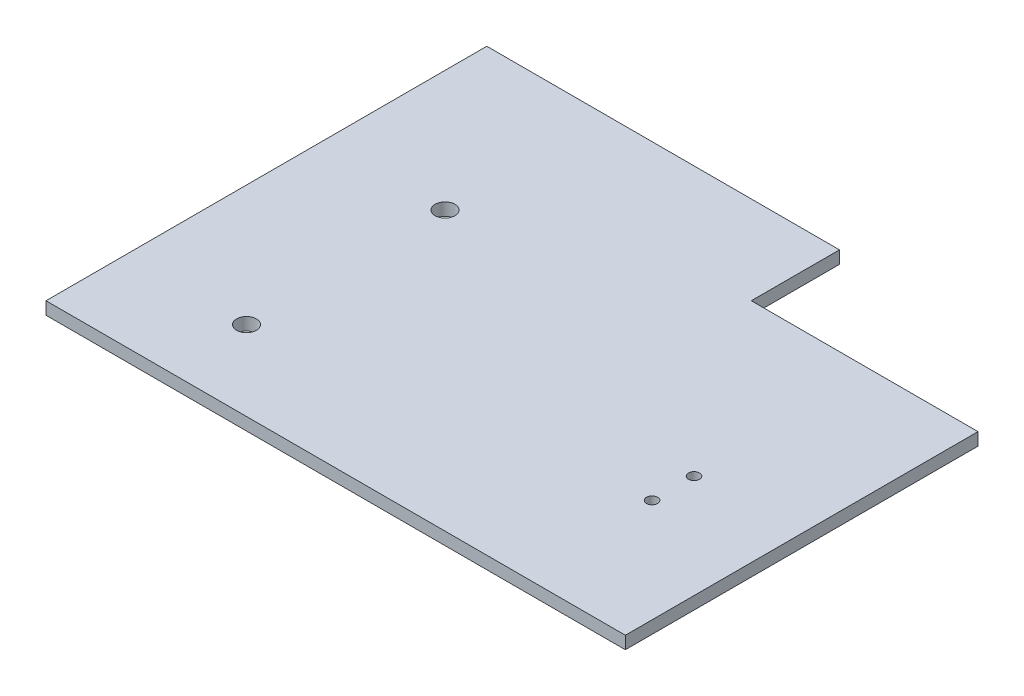
ISO-10303-21;
HEADER;
FILE_DESCRIPTION(('STEP AP214'),'2;1');
FILE_NAME('part.step','',(''),(''),'','','');
FILE_SCHEMA(('AUTOMOTIVE_DESIGN { 1 0 10303 214 1 1 1 1 }'));
ENDSEC;
DATA;
#1=APPLICATION_CONTEXT('core data for automotive mechanical design processes');
#2=APPLICATION_PROTOCOL_DEFINITION('international standard','automotive_design',2000,#1);
#3=PRODUCT_CONTEXT('',#1,'mechanical');
#4=PRODUCT('Part','Part','',(#3));
#5=PRODUCT_RELATED_PRODUCT_CATEGORY('part','',(#4));
#6=PRODUCT_DEFINITION_FORMATION('','',#4);
#7=PRODUCT_DEFINITION_CONTEXT('part definition',#1,'design');
#8=PRODUCT_DEFINITION('design','',#6,#7);
#9=PRODUCT_DEFINITION_SHAPE('','',#8);
#10=(LENGTH_UNIT() NAMED_UNIT(*) SI_UNIT(.MILLI.,.METRE.));
#11=(NAMED_UNIT(*) PLANE_ANGLE_UNIT() SI_UNIT($,.RADIAN.));
#12=(NAMED_UNIT(*) SI_UNIT($,.STERADIAN.) SOLID_ANGLE_UNIT());
#13=UNCERTAINTY_MEASURE_WITH_UNIT(LENGTH_MEASURE(1.E-05),#10,'distance_accuracy_value','');
#14=(GEOMETRIC_REPRESENTATION_CONTEXT(3) GLOBAL_UNCERTAINTY_ASSIGNED_CONTEXT((#13)) GLOBAL_UNIT_ASSIGNED_CONTEXT((#10,
#11,#12)) REPRESENTATION_CONTEXT('',''));
#15=CARTESIAN_POINT('',(0.,0.,0.));
#16=DIRECTION('',(0.,0.,1.));
#17=DIRECTION('',(1.,0.,0.));
#18=AXIS2_PLACEMENT_3D('',#15,#16,#17);
#19=CARTESIAN_POINT('',(-292.1,-0.00999999999999959,-222.25));
#20=DIRECTION('',(-1.,0.,0.));
#21=DIRECTION('',(0.,0.,1.));
#22=AXIS2_PLACEMENT_3D('',#19,#20,#21);
#23=PLANE('',#22);
#24=DIRECTION('',(0.,-1.,0.));
#25=VECTOR('',#24,1.);
#26=CARTESIAN_POINT('',(-292.1,6.35,-222.25));
#27=LINE('',#26,#25);
#28=CARTESIAN_POINT('',(-292.1,6.35,-222.25));
#29=VERTEX_POINT('',#28);
#30=CARTESIAN_POINT('',(-292.1,0.,-222.25));
#31=VERTEX_POINT('',#30);
#32=EDGE_CURVE('E134',#29,#31,#27,.T.);
#33=ORIENTED_EDGE('',*,*,#32,.T.);
#34=DIRECTION('',(0.,0.,1.));
#35=VECTOR('',#34,1.);
#36=CARTESIAN_POINT('',(-292.1,0.,0.));
#37=LINE('',#36,#35);
#38=CARTESIAN_POINT('',(-292.1,0.,0.));
#39=VERTEX_POINT('',#38);
#40=EDGE_CURVE('E122',#31,#39,#37,.T.);
#41=ORIENTED_EDGE('',*,*,#40,.T.);
#42=DIRECTION('',(0.,1.,0.));
#43=VECTOR('',#42,1.);
#44=CARTESIAN_POINT('',(-292.1,6.35,0.));
#45=LINE('',#44,#43);
#46=CARTESIAN_POINT('',(-292.1,6.35,0.));
#47=VERTEX_POINT('',#46);
#48=EDGE_CURVE('E129',#39,#47,#45,.T.);
#49=ORIENTED_EDGE('',*,*,#48,.T.);
#50=DIRECTION('',(0.,0.,1.));
#51=VECTOR('',#50,1.);
#52=CARTESIAN_POINT('',(-292.1,6.35,0.));
#53=LINE('',#52,#51);
#54=EDGE_CURVE('E133',#29,#47,#53,.T.);
#55=ORIENTED_EDGE('',*,*,#54,.F.);
#56=EDGE_LOOP('',(#33,#41,#49,#55));
#57=FACE_BOUND('',#56,.T.);
#58=ADVANCED_FACE('F44',(#57),#23,.T.);
#59=CARTESIAN_POINT('',(-558.8,6.35,0.));
#60=DIRECTION('',(0.,0.,-1.));
#61=DIRECTION('',(-1.,0.,0.));
#62=AXIS2_PLACEMENT_3D('',#59,#60,#61);
#63=PLANE('',#62);
#64=ORIENTED_EDGE('',*,*,#48,.F.);
#65=DIRECTION('',(1.,0.,0.));
#66=VECTOR('',#65,1.);
#67=CARTESIAN_POINT('',(-558.8,0.,0.));
#68=LINE('',#67,#66);
#69=CARTESIAN_POINT('',(0.,0.,0.));
#70=VERTEX_POINT('',#69);
#71=EDGE_CURVE('E48',#39,#70,#68,.T.);
#72=ORIENTED_EDGE('',*,*,#71,.T.);
#73=DIRECTION('',(0.,-1.,0.));
#74=VECTOR('',#73,1.);
#75=CARTESIAN_POINT('',(0.,6.35,0.));
#76=LINE('',#75,#74);
#77=CARTESIAN_POINT('',(0.,6.35,0.));
#78=VERTEX_POINT('',#77);
#79=EDGE_CURVE('E197',#78,#70,#76,.T.);
#80=ORIENTED_EDGE('',*,*,#79,.F.);
#81=DIRECTION('',(1.,0.,0.));
#82=VECTOR('',#81,1.);
#83=CARTESIAN_POINT('',(-558.8,6.35,0.));
#84=LINE('',#83,#82);
#85=EDGE_CURVE('E94',#47,#78,#84,.T.);
#86=ORIENTED_EDGE('',*,*,#85,.F.);
#87=EDGE_LOOP('',(#64,#72,#80,#86));
#88=FACE_BOUND('',#87,.T.);
#89=ADVANCED_FACE('F130',(#88),#63,.F.);
#90=CARTESIAN_POINT('',(-114.3,6.35,-222.25));
#91=DIRECTION('',(0.,0.,1.));
#92=DIRECTION('',(1.,0.,0.));
#93=AXIS2_PLACEMENT_3D('',#90,#91,#92);
#94=PLANE('',#93);
#95=ORIENTED_EDGE('',*,*,#32,.F.);
#96=DIRECTION('',(-1.,0.,0.));
#97=VECTOR('',#96,1.);
#98=CARTESIAN_POINT('',(-114.3,6.35,-222.25));
#99=LINE('',#98,#97);
#100=CARTESIAN_POINT('',(-114.3,6.35,-222.25));
#101=VERTEX_POINT('',#100);
#102=EDGE_CURVE('E145',#101,#29,#99,.T.);
#103=ORIENTED_EDGE('',*,*,#102,.F.);
#104=DIRECTION('',(0.,-1.,0.));
#105=VECTOR('',#104,1.);
#106=CARTESIAN_POINT('',(-114.3,6.35,-222.25));
#107=LINE('',#106,#105);
#108=CARTESIAN_POINT('',(-114.3,0.,-222.25));
#109=VERTEX_POINT('',#108);
#110=EDGE_CURVE('E150',#101,#109,#107,.T.);
#111=ORIENTED_EDGE('',*,*,#110,.T.);
#112=DIRECTION('',(-1.,0.,0.));
#113=VECTOR('',#112,1.);
#114=CARTESIAN_POINT('',(-114.3,0.,-222.25));
#115=LINE('',#114,#113);
#116=EDGE_CURVE('E152',#109,#31,#115,.T.);
#117=ORIENTED_EDGE('',*,*,#116,.T.);
#118=EDGE_LOOP('',(#95,#103,#111,#117));
#119=FACE_BOUND('',#118,.T.);
#120=ADVANCED_FACE('F211',(#119),#94,.F.);
#121=CARTESIAN_POINT('',(0.,6.35,0.));
#122=DIRECTION('',(0.,1.,0.));
#123=DIRECTION('',(0.,0.,1.));
#124=AXIS2_PLACEMENT_3D('',#121,#122,#123);
#125=PLANE('',#124);
#126=CARTESIAN_POINT('',(-231.14,6.35,-40.132));
#127=DIRECTION('',(0.,1.,0.));
#128=DIRECTION('',(0.,0.,1.));
#129=AXIS2_PLACEMENT_3D('',#126,#127,#128);
#130=CIRCLE('',#129,5.00000270000002);
#131=CARTESIAN_POINT('',(-231.14,6.35,-35.1319973));
#132=VERTEX_POINT('',#131);
#133=EDGE_CURVE('E174',#132,#132,#130,.T.);
#134=ORIENTED_EDGE('',*,*,#133,.F.);
#135=EDGE_LOOP('',(#134));
#136=FACE_BOUND('',#135,.T.);
#137=CARTESIAN_POINT('',(-231.14,6.35,-140.208));
#138=DIRECTION('',(0.,1.,0.));
#139=DIRECTION('',(0.,0.,1.));
#140=AXIS2_PLACEMENT_3D('',#137,#138,#139);
#141=CIRCLE('',#140,5.00000270000002);
#142=CARTESIAN_POINT('',(-231.14,6.35,-135.2079973));
#143=VERTEX_POINT('',#142);
#144=EDGE_CURVE('E127',#143,#143,#141,.T.);
#145=ORIENTED_EDGE('',*,*,#144,.F.);
#146=EDGE_LOOP('',(#145));
#147=FACE_BOUND('',#146,.T.);
#148=CARTESIAN_POINT('',(-52.1589,6.35,-86.7833333333333));
#149=DIRECTION('',(0.,-1.,0.));
#150=DIRECTION('',(0.,0.,-1.));
#151=AXIS2_PLACEMENT_3D('',#148,#149,#150);
#152=CIRCLE('',#151,2.778125);
#153=CARTESIAN_POINT('',(-52.1589,6.35,-89.5614583333334));
#154=VERTEX_POINT('',#153);
#155=EDGE_CURVE('E183',#154,#154,#152,.T.);
#156=ORIENTED_EDGE('',*,*,#155,.T.);
#157=EDGE_LOOP('',(#156));
#158=FACE_BOUND('',#157,.T.);
#159=CARTESIAN_POINT('',(-52.1589,6.35,-65.6166666666667));
#160=DIRECTION('',(0.,-1.,0.));
#161=DIRECTION('',(0.,0.,-1.));
#162=AXIS2_PLACEMENT_3D('',#159,#160,#161);
#163=CIRCLE('',#162,2.778125);
#164=CARTESIAN_POINT('',(-52.1589,6.35,-68.3947916666667));
#165=VERTEX_POINT('',#164);
#166=EDGE_CURVE('E55',#165,#165,#163,.T.);
#167=ORIENTED_EDGE('',*,*,#166,.T.);
#168=EDGE_LOOP('',(#167));
#169=FACE_BOUND('',#168,.T.);
#170=ORIENTED_EDGE('',*,*,#102,.T.);
#171=ORIENTED_EDGE('',*,*,#54,.T.);
#172=ORIENTED_EDGE('',*,*,#85,.T.);
#173=DIRECTION('',(0.,0.,-1.));
#174=VECTOR('',#173,1.);
#175=CARTESIAN_POINT('',(0.,6.35,0.));
#176=LINE('',#175,#174);
#177=CARTESIAN_POINT('',(0.,6.35,-177.8));
#178=VERTEX_POINT('',#177);
#179=EDGE_CURVE('E89',#78,#178,#176,.T.);
#180=ORIENTED_EDGE('',*,*,#179,.T.);
#181=DIRECTION('',(-1.,0.,0.));
#182=VECTOR('',#181,1.);
#183=CARTESIAN_POINT('',(0.,6.35,-177.8));
#184=LINE('',#183,#182);
#185=CARTESIAN_POINT('',(-114.3,6.35,-177.8));
#186=VERTEX_POINT('',#185);
#187=EDGE_CURVE('E167',#178,#186,#184,.T.);
#188=ORIENTED_EDGE('',*,*,#187,.T.);
#189=DIRECTION('',(0.,0.,-1.));
#190=VECTOR('',#189,1.);
#191=CARTESIAN_POINT('',(-114.3,6.35,-177.8));
#192=LINE('',#191,#190);
#193=EDGE_CURVE('E149',#186,#101,#192,.T.);
#194=ORIENTED_EDGE('',*,*,#193,.T.);
#195=EDGE_LOOP('',(#170,#171,#172,#180,#188,#194));
#196=FACE_BOUND('',#195,.T.);
#197=ADVANCED_FACE('F46',(#136,#147,#158,#169,#196),#125,.T.);
#198=CARTESIAN_POINT('',(0.,0.,0.));
#199=DIRECTION('',(0.,1.,0.));
#200=DIRECTION('',(0.,0.,1.));
#201=AXIS2_PLACEMENT_3D('',#198,#199,#200);
#202=PLANE('',#201);
#203=CARTESIAN_POINT('',(-231.14,0.,-40.132));
#204=DIRECTION('',(0.,1.,0.));
#205=DIRECTION('',(0.,0.,1.));
#206=AXIS2_PLACEMENT_3D('',#203,#204,#205);
#207=CIRCLE('',#206,5.00000270000002);
#208=CARTESIAN_POINT('',(-231.14,0.,-35.1319973));
#209=VERTEX_POINT('',#208);
#210=EDGE_CURVE('E178',#209,#209,#207,.T.);
#211=ORIENTED_EDGE('',*,*,#210,.T.);
#212=EDGE_LOOP('',(#211));
#213=FACE_BOUND('',#212,.T.);
#214=CARTESIAN_POINT('',(-231.14,0.,-140.208));
#215=DIRECTION('',(0.,1.,0.));
#216=DIRECTION('',(0.,0.,1.));
#217=AXIS2_PLACEMENT_3D('',#214,#215,#216);
#218=CIRCLE('',#217,5.00000270000002);
#219=CARTESIAN_POINT('',(-231.14,0.,-135.2079973));
#220=VERTEX_POINT('',#219);
#221=EDGE_CURVE('E179',#220,#220,#218,.T.);
#222=ORIENTED_EDGE('',*,*,#221,.T.);
#223=EDGE_LOOP('',(#222));
#224=FACE_BOUND('',#223,.T.);
#225=CARTESIAN_POINT('',(-52.1589,0.,-86.7833333333333));
#226=DIRECTION('',(0.,-1.,0.));
#227=DIRECTION('',(0.,0.,-1.));
#228=AXIS2_PLACEMENT_3D('',#225,#226,#227);
#229=CIRCLE('',#228,2.778125);
#230=CARTESIAN_POINT('',(-52.1589,0.,-89.5614583333334));
#231=VERTEX_POINT('',#230);
#232=EDGE_CURVE('E187',#231,#231,#229,.T.);
#233=ORIENTED_EDGE('',*,*,#232,.F.);
#234=EDGE_LOOP('',(#233));
#235=FACE_BOUND('',#234,.T.);
#236=CARTESIAN_POINT('',(-52.1589,0.,-65.6166666666667));
#237=DIRECTION('',(0.,-1.,0.));
#238=DIRECTION('',(0.,0.,-1.));
#239=AXIS2_PLACEMENT_3D('',#236,#237,#238);
#240=CIRCLE('',#239,2.778125);
#241=CARTESIAN_POINT('',(-52.1589,0.,-68.3947916666667));
#242=VERTEX_POINT('',#241);
#243=EDGE_CURVE('E11',#242,#242,#240,.T.);
#244=ORIENTED_EDGE('',*,*,#243,.F.);
#245=EDGE_LOOP('',(#244));
#246=FACE_BOUND('',#245,.T.);
#247=ORIENTED_EDGE('',*,*,#40,.F.);
#248=ORIENTED_EDGE('',*,*,#116,.F.);
#249=DIRECTION('',(0.,0.,-1.));
#250=VECTOR('',#249,1.);
#251=CARTESIAN_POINT('',(-114.3,0.,-177.8));
#252=LINE('',#251,#250);
#253=CARTESIAN_POINT('',(-114.3,0.,-177.8));
#254=VERTEX_POINT('',#253);
#255=EDGE_CURVE('E103',#254,#109,#252,.T.);
#256=ORIENTED_EDGE('',*,*,#255,.F.);
#257=DIRECTION('',(-1.,0.,0.));
#258=VECTOR('',#257,1.);
#259=CARTESIAN_POINT('',(0.,0.,-177.8));
#260=LINE('',#259,#258);
#261=CARTESIAN_POINT('',(0.,0.,-177.8));
#262=VERTEX_POINT('',#261);
#263=EDGE_CURVE('E156',#262,#254,#260,.T.);
#264=ORIENTED_EDGE('',*,*,#263,.F.);
#265=DIRECTION('',(0.,0.,-1.));
#266=VECTOR('',#265,1.);
#267=CARTESIAN_POINT('',(0.,0.,0.));
#268=LINE('',#267,#266);
#269=EDGE_CURVE('E124',#70,#262,#268,.T.);
#270=ORIENTED_EDGE('',*,*,#269,.F.);
#271=ORIENTED_EDGE('',*,*,#71,.F.);
#272=EDGE_LOOP('',(#247,#248,#256,#264,#270,#271));
#273=FACE_BOUND('',#272,.T.);
#274=ADVANCED_FACE('F119',(#213,#224,#235,#246,#273),#202,.F.);
#275=CARTESIAN_POINT('',(0.,6.35,0.));
#276=DIRECTION('',(-1.,0.,0.));
#277=DIRECTION('',(0.,0.,1.));
#278=AXIS2_PLACEMENT_3D('',#275,#276,#277);
#279=PLANE('',#278);
#280=ORIENTED_EDGE('',*,*,#269,.T.);
#281=DIRECTION('',(0.,-1.,0.));
#282=VECTOR('',#281,1.);
#283=CARTESIAN_POINT('',(0.,6.35,-177.8));
#284=LINE('',#283,#282);
#285=EDGE_CURVE('E199',#178,#262,#284,.T.);
#286=ORIENTED_EDGE('',*,*,#285,.F.);
#287=ORIENTED_EDGE('',*,*,#179,.F.);
#288=ORIENTED_EDGE('',*,*,#79,.T.);
#289=EDGE_LOOP('',(#280,#286,#287,#288));
#290=FACE_BOUND('',#289,.T.);
#291=ADVANCED_FACE('F215',(#290),#279,.F.);
#292=CARTESIAN_POINT('',(0.,6.35,-177.8));
#293=DIRECTION('',(0.,0.,1.));
#294=DIRECTION('',(1.,0.,0.));
#295=AXIS2_PLACEMENT_3D('',#292,#293,#294);
#296=PLANE('',#295);
#297=ORIENTED_EDGE('',*,*,#263,.T.);
#298=DIRECTION('',(0.,-1.,0.));
#299=VECTOR('',#298,1.);
#300=CARTESIAN_POINT('',(-114.3,6.35,-177.8));
#301=LINE('',#300,#299);
#302=EDGE_CURVE('E205',#186,#254,#301,.T.);
#303=ORIENTED_EDGE('',*,*,#302,.F.);
#304=ORIENTED_EDGE('',*,*,#187,.F.);
#305=ORIENTED_EDGE('',*,*,#285,.T.);
#306=EDGE_LOOP('',(#297,#303,#304,#305));
#307=FACE_BOUND('',#306,.T.);
#308=ADVANCED_FACE('F213',(#307),#296,.F.);
#309=CARTESIAN_POINT('',(-114.3,6.35,-177.8));
#310=DIRECTION('',(-1.,0.,0.));
#311=DIRECTION('',(0.,0.,1.));
#312=AXIS2_PLACEMENT_3D('',#309,#310,#311);
#313=PLANE('',#312);
#314=ORIENTED_EDGE('',*,*,#255,.T.);
#315=ORIENTED_EDGE('',*,*,#110,.F.);
#316=ORIENTED_EDGE('',*,*,#193,.F.);
#317=ORIENTED_EDGE('',*,*,#302,.T.);
#318=EDGE_LOOP('',(#314,#315,#316,#317));
#319=FACE_BOUND('',#318,.T.);
#320=ADVANCED_FACE('F222',(#319),#313,.F.);
#321=CARTESIAN_POINT('',(-231.14,0.,-40.132));
#322=DIRECTION('',(0.,1.,0.));
#323=DIRECTION('',(0.,0.,1.));
#324=AXIS2_PLACEMENT_3D('',#321,#322,#323);
#325=CYLINDRICAL_SURFACE('',#324,5.00000270000002);
#326=ORIENTED_EDGE('',*,*,#133,.T.);
#327=EDGE_LOOP('',(#326));
#328=FACE_BOUND('',#327,.T.);
#329=ORIENTED_EDGE('',*,*,#210,.F.);
#330=EDGE_LOOP('',(#329));
#331=FACE_BOUND('',#330,.T.);
#332=ADVANCED_FACE('F243',(#328,#331),#325,.F.);
#333=CARTESIAN_POINT('',(-231.14,0.,-140.208));
#334=DIRECTION('',(0.,1.,0.));
#335=DIRECTION('',(0.,0.,1.));
#336=AXIS2_PLACEMENT_3D('',#333,#334,#335);
#337=CYLINDRICAL_SURFACE('',#336,5.00000270000002);
#338=ORIENTED_EDGE('',*,*,#144,.T.);
#339=EDGE_LOOP('',(#338));
#340=FACE_BOUND('',#339,.T.);
#341=ORIENTED_EDGE('',*,*,#221,.F.);
#342=EDGE_LOOP('',(#341));
#343=FACE_BOUND('',#342,.T.);
#344=ADVANCED_FACE('F241',(#340,#343),#337,.F.);
#345=CARTESIAN_POINT('',(-52.1589,6.35,-86.7833333333333));
#346=DIRECTION('',(0.,-1.,0.));
#347=DIRECTION('',(0.,0.,-1.));
#348=AXIS2_PLACEMENT_3D('',#345,#346,#347);
#349=CYLINDRICAL_SURFACE('',#348,2.778125);
#350=ORIENTED_EDGE('',*,*,#155,.F.);
#351=EDGE_LOOP('',(#350));
#352=FACE_BOUND('',#351,.T.);
#353=ORIENTED_EDGE('',*,*,#232,.T.);
#354=EDGE_LOOP('',(#353));
#355=FACE_BOUND('',#354,.T.);
#356=ADVANCED_FACE('F237',(#352,#355),#349,.F.);
#357=CARTESIAN_POINT('',(-52.1589,6.35,-65.6166666666667));
#358=DIRECTION('',(0.,-1.,0.));
#359=DIRECTION('',(0.,0.,-1.));
#360=AXIS2_PLACEMENT_3D('',#357,#358,#359);
#361=CYLINDRICAL_SURFACE('',#360,2.778125);
#362=ORIENTED_EDGE('',*,*,#166,.F.);
#363=EDGE_LOOP('',(#362));
#364=FACE_BOUND('',#363,.T.);
#365=ORIENTED_EDGE('',*,*,#243,.T.);
#366=EDGE_LOOP('',(#365));
#367=FACE_BOUND('',#366,.T.);
#368=ADVANCED_FACE('F233',(#364,#367),#361,.F.);
#369=CLOSED_SHELL('',(#58,#89,#120,#197,#274,#291,#308,#320,#332,#344,#356,#368));
#370=MANIFOLD_SOLID_BREP('B2',#369);
#371=ADVANCED_BREP_SHAPE_REPRESENTATION('',(#18,#370),#14);
#372=SHAPE_DEFINITION_REPRESENTATION(#9,#371);
ENDSEC;
END-ISO-10303-21;
